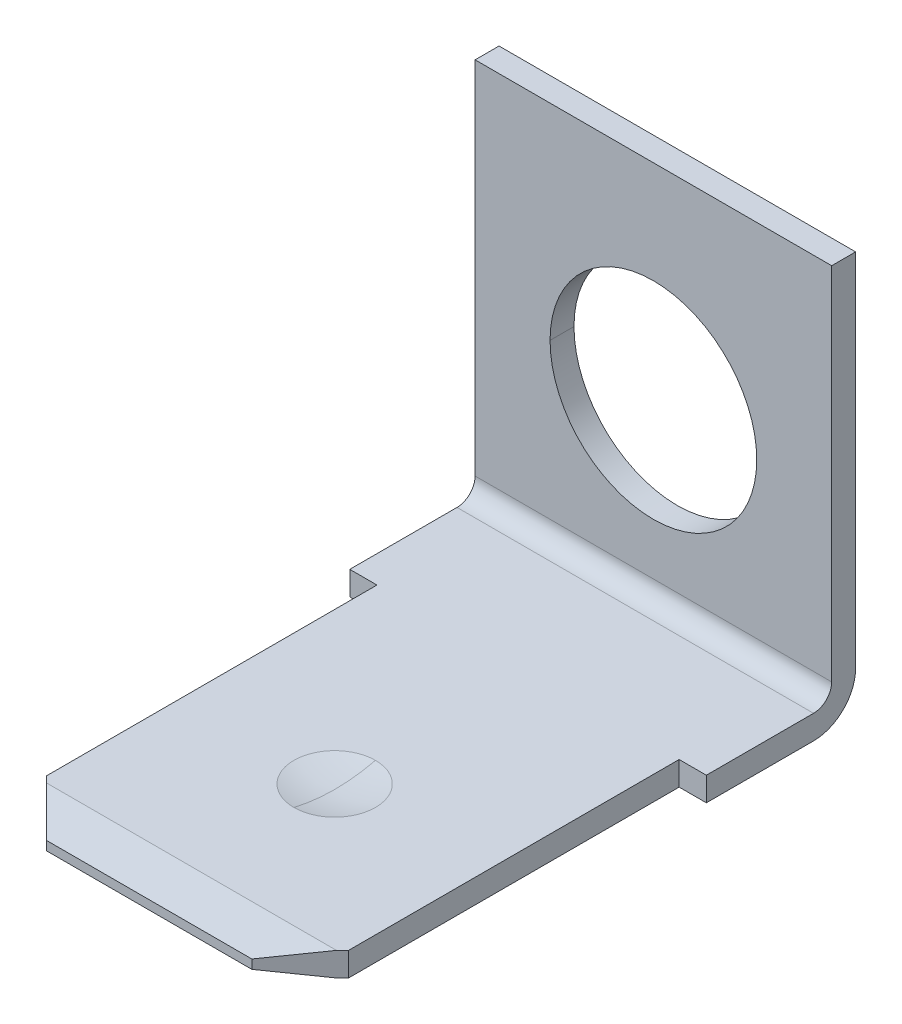
ISO-10303-21;
HEADER;
FILE_DESCRIPTION(('STEP AP214'),'2;1');
FILE_NAME('part.step','',(''),(''),'','','');
FILE_SCHEMA(('AUTOMOTIVE_DESIGN { 1 0 10303 214 1 1 1 1 }'));
ENDSEC;
DATA;
#1=APPLICATION_CONTEXT('core data for automotive mechanical design processes');
#2=APPLICATION_PROTOCOL_DEFINITION('international standard','automotive_design',2000,#1);
#3=PRODUCT_CONTEXT('',#1,'mechanical');
#4=PRODUCT('Part','Part','',(#3));
#5=PRODUCT_RELATED_PRODUCT_CATEGORY('part','',(#4));
#6=PRODUCT_DEFINITION_FORMATION('','',#4);
#7=PRODUCT_DEFINITION_CONTEXT('part definition',#1,'design');
#8=PRODUCT_DEFINITION('design','',#6,#7);
#9=PRODUCT_DEFINITION_SHAPE('','',#8);
#10=(LENGTH_UNIT() NAMED_UNIT(*) SI_UNIT(.MILLI.,.METRE.));
#11=(NAMED_UNIT(*) PLANE_ANGLE_UNIT() SI_UNIT($,.RADIAN.));
#12=(NAMED_UNIT(*) SI_UNIT($,.STERADIAN.) SOLID_ANGLE_UNIT());
#13=UNCERTAINTY_MEASURE_WITH_UNIT(LENGTH_MEASURE(1.E-05),#10,'distance_accuracy_value','');
#14=(GEOMETRIC_REPRESENTATION_CONTEXT(3) GLOBAL_UNCERTAINTY_ASSIGNED_CONTEXT((#13)) GLOBAL_UNIT_ASSIGNED_CONTEXT((#10,
#11,#12)) REPRESENTATION_CONTEXT('',''));
#15=CARTESIAN_POINT('',(0.,0.,0.));
#16=DIRECTION('',(0.,0.,1.));
#17=DIRECTION('',(1.,0.,0.));
#18=AXIS2_PLACEMENT_3D('',#15,#16,#17);
#19=CARTESIAN_POINT('',(0.,4.0686434375,-3.8989));
#20=DIRECTION('',(0.,1.,0.));
#21=DIRECTION('',(0.,0.,-1.));
#22=AXIS2_PLACEMENT_3D('',#19,#20,#21);
#23=SPHERICAL_SURFACE('',#22,3.6673234375);
#24=CARTESIAN_POINT('',(0.,4.0686434375,-3.8989));
#25=DIRECTION('',(1.,0.,0.));
#26=DIRECTION('',(0.,-1.,0.));
#27=AXIS2_PLACEMENT_3D('',#24,#25,#26);
#28=CIRCLE('',#27,3.6673234375);
#29=CARTESIAN_POINT('',(0.,0.40132,-3.8989));
#30=VERTEX_POINT('',#29);
#31=CARTESIAN_POINT('',(0.,0.50292,-4.75615));
#32=VERTEX_POINT('',#31);
#33=EDGE_CURVE('E10',#30,#32,#28,.T.);
#34=ORIENTED_EDGE('',*,*,#33,.F.);
#35=CARTESIAN_POINT('',(0.,4.0686434375,-3.8989));
#36=DIRECTION('',(-1.,0.,0.));
#37=DIRECTION('',(0.,-1.,0.));
#38=AXIS2_PLACEMENT_3D('',#35,#36,#37);
#39=CIRCLE('',#38,3.6673234375);
#40=CARTESIAN_POINT('',(0.,0.50292,-3.04165));
#41=VERTEX_POINT('',#40);
#42=EDGE_CURVE('E26',#30,#41,#39,.T.);
#43=ORIENTED_EDGE('',*,*,#42,.T.);
#44=CARTESIAN_POINT('',(0.,0.50292,-3.8989));
#45=DIRECTION('',(0.,1.,0.));
#46=DIRECTION('',(0.,0.,1.));
#47=AXIS2_PLACEMENT_3D('',#44,#45,#46);
#48=CIRCLE('',#47,0.85725);
#49=EDGE_CURVE('E301',#41,#32,#48,.T.);
#50=ORIENTED_EDGE('',*,*,#49,.T.);
#51=EDGE_LOOP('',(#34,#43,#50));
#52=FACE_BOUND('',#51,.T.);
#53=ADVANCED_FACE('F16',(#52),#23,.F.);
#54=CARTESIAN_POINT('',(0.,4.0686434375,-3.8989));
#55=DIRECTION('',(0.,1.,0.));
#56=DIRECTION('',(0.,0.,-1.));
#57=AXIS2_PLACEMENT_3D('',#54,#55,#56);
#58=SPHERICAL_SURFACE('',#57,3.6673234375);
#59=ORIENTED_EDGE('',*,*,#42,.F.);
#60=ORIENTED_EDGE('',*,*,#33,.T.);
#61=CARTESIAN_POINT('',(0.,0.50292,-3.8989));
#62=DIRECTION('',(0.,1.,0.));
#63=DIRECTION('',(0.,0.,-1.));
#64=AXIS2_PLACEMENT_3D('',#61,#62,#63);
#65=CIRCLE('',#64,0.85725);
#66=EDGE_CURVE('E304',#32,#41,#65,.T.);
#67=ORIENTED_EDGE('',*,*,#66,.T.);
#68=EDGE_LOOP('',(#59,#60,#67));
#69=FACE_BOUND('',#68,.T.);
#70=ADVANCED_FACE('F557',(#69),#58,.F.);
#71=CARTESIAN_POINT('',(0.,4.1402,-10.59688));
#72=DIRECTION('',(0.,0.,1.));
#73=DIRECTION('',(1.,0.,0.));
#74=AXIS2_PLACEMENT_3D('',#71,#72,#73);
#75=CYLINDRICAL_SURFACE('',#74,2.1717);
#76=DIRECTION('',(0.,0.,-1.));
#77=VECTOR('',#76,1.);
#78=CARTESIAN_POINT('',(-2.1717,4.1402,-10.59688));
#79=LINE('',#78,#77);
#80=CARTESIAN_POINT('',(-2.1717,4.1402,-10.59688));
#81=VERTEX_POINT('',#80);
#82=CARTESIAN_POINT('',(-2.1717,4.1402,-11.0998));
#83=VERTEX_POINT('',#82);
#84=EDGE_CURVE('E211',#81,#83,#79,.T.);
#85=ORIENTED_EDGE('',*,*,#84,.F.);
#86=CARTESIAN_POINT('',(0.,4.1402,-10.59688));
#87=DIRECTION('',(0.,0.,1.));
#88=DIRECTION('',(-1.,0.,0.));
#89=AXIS2_PLACEMENT_3D('',#86,#87,#88);
#90=CIRCLE('',#89,2.1717);
#91=CARTESIAN_POINT('',(2.1717,4.1402,-10.59688));
#92=VERTEX_POINT('',#91);
#93=EDGE_CURVE('E271',#81,#92,#90,.T.);
#94=ORIENTED_EDGE('',*,*,#93,.T.);
#95=DIRECTION('',(0.,0.,-1.));
#96=VECTOR('',#95,1.);
#97=CARTESIAN_POINT('',(2.1717,4.1402,-10.59688));
#98=LINE('',#97,#96);
#99=CARTESIAN_POINT('',(2.1717,4.1402,-11.0998));
#100=VERTEX_POINT('',#99);
#101=EDGE_CURVE('E345',#92,#100,#98,.T.);
#102=ORIENTED_EDGE('',*,*,#101,.T.);
#103=CARTESIAN_POINT('',(0.,4.1402,-11.0998));
#104=DIRECTION('',(0.,0.,1.));
#105=DIRECTION('',(-1.,0.,0.));
#106=AXIS2_PLACEMENT_3D('',#103,#104,#105);
#107=CIRCLE('',#106,2.1717);
#108=EDGE_CURVE('E207',#83,#100,#107,.T.);
#109=ORIENTED_EDGE('',*,*,#108,.F.);
#110=EDGE_LOOP('',(#85,#94,#102,#109));
#111=FACE_BOUND('',#110,.T.);
#112=ADVANCED_FACE('F561',(#111),#75,.F.);
#113=CARTESIAN_POINT('',(0.,4.1402,-10.59688));
#114=DIRECTION('',(0.,0.,1.));
#115=DIRECTION('',(1.,0.,0.));
#116=AXIS2_PLACEMENT_3D('',#113,#114,#115);
#117=CYLINDRICAL_SURFACE('',#116,2.1717);
#118=ORIENTED_EDGE('',*,*,#101,.F.);
#119=CARTESIAN_POINT('',(0.,4.1402,-10.59688));
#120=DIRECTION('',(0.,0.,1.));
#121=DIRECTION('',(1.,0.,0.));
#122=AXIS2_PLACEMENT_3D('',#119,#120,#121);
#123=CIRCLE('',#122,2.1717);
#124=EDGE_CURVE('E313',#92,#81,#123,.T.);
#125=ORIENTED_EDGE('',*,*,#124,.T.);
#126=ORIENTED_EDGE('',*,*,#84,.T.);
#127=CARTESIAN_POINT('',(0.,4.1402,-11.0998));
#128=DIRECTION('',(0.,0.,1.));
#129=DIRECTION('',(1.,0.,0.));
#130=AXIS2_PLACEMENT_3D('',#127,#128,#129);
#131=CIRCLE('',#130,2.1717);
#132=EDGE_CURVE('E276',#100,#83,#131,.T.);
#133=ORIENTED_EDGE('',*,*,#132,.F.);
#134=EDGE_LOOP('',(#118,#125,#126,#133));
#135=FACE_BOUND('',#134,.T.);
#136=ADVANCED_FACE('F567',(#135),#117,.F.);
#137=CARTESIAN_POINT('',(0.,-3.5657234375,-3.8989));
#138=DIRECTION('',(0.,1.,0.));
#139=DIRECTION('',(0.,0.,-1.));
#140=AXIS2_PLACEMENT_3D('',#137,#138,#139);
#141=SPHERICAL_SURFACE('',#140,3.6673234375);
#142=CARTESIAN_POINT('',(0.,-3.5657234375,-3.8989));
#143=DIRECTION('',(-1.,0.,0.));
#144=DIRECTION('',(0.,0.972295871435534,0.233753584762708));
#145=AXIS2_PLACEMENT_3D('',#142,#143,#144);
#146=CIRCLE('',#145,3.6673234375);
#147=CARTESIAN_POINT('',(0.,0.,-3.04165));
#148=VERTEX_POINT('',#147);
#149=CARTESIAN_POINT('',(0.,0.1016,-3.8989));
#150=VERTEX_POINT('',#149);
#151=EDGE_CURVE('E342',#148,#150,#146,.T.);
#152=ORIENTED_EDGE('',*,*,#151,.T.);
#153=CARTESIAN_POINT('',(0.,-3.5657234375,-3.8989));
#154=DIRECTION('',(1.,0.,0.));
#155=DIRECTION('',(0.,0.972295871435534,-0.233753584762708));
#156=AXIS2_PLACEMENT_3D('',#153,#154,#155);
#157=CIRCLE('',#156,3.6673234375);
#158=CARTESIAN_POINT('',(0.,0.,-4.75615));
#159=VERTEX_POINT('',#158);
#160=EDGE_CURVE('E243',#159,#150,#157,.T.);
#161=ORIENTED_EDGE('',*,*,#160,.F.);
#162=CARTESIAN_POINT('',(0.,0.,-3.8989));
#163=DIRECTION('',(0.,1.,0.));
#164=DIRECTION('',(0.,0.,1.));
#165=AXIS2_PLACEMENT_3D('',#162,#163,#164);
#166=CIRCLE('',#165,0.85725);
#167=EDGE_CURVE('E183',#148,#159,#166,.T.);
#168=ORIENTED_EDGE('',*,*,#167,.F.);
#169=EDGE_LOOP('',(#152,#161,#168));
#170=FACE_BOUND('',#169,.T.);
#171=ADVANCED_FACE('F570',(#170),#141,.F.);
#172=CARTESIAN_POINT('',(0.,-3.5657234375,-3.8989));
#173=DIRECTION('',(0.,1.,0.));
#174=DIRECTION('',(0.,0.,-1.));
#175=AXIS2_PLACEMENT_3D('',#172,#173,#174);
#176=SPHERICAL_SURFACE('',#175,3.6673234375);
#177=ORIENTED_EDGE('',*,*,#160,.T.);
#178=ORIENTED_EDGE('',*,*,#151,.F.);
#179=CARTESIAN_POINT('',(0.,0.,-3.8989));
#180=DIRECTION('',(0.,1.,0.));
#181=DIRECTION('',(0.,0.,-1.));
#182=AXIS2_PLACEMENT_3D('',#179,#180,#181);
#183=CIRCLE('',#182,0.85725);
#184=EDGE_CURVE('E172',#159,#148,#183,.T.);
#185=ORIENTED_EDGE('',*,*,#184,.F.);
#186=EDGE_LOOP('',(#177,#178,#185));
#187=FACE_BOUND('',#186,.T.);
#188=ADVANCED_FACE('F651',(#187),#176,.F.);
#189=CARTESIAN_POINT('',(3.175,0.50292,-7.9629));
#190=DIRECTION('',(-1.,0.,0.));
#191=DIRECTION('',(0.,0.,1.));
#192=AXIS2_PLACEMENT_3D('',#189,#190,#191);
#193=PLANE('',#192);
#194=DIRECTION('',(0.,-1.,0.));
#195=VECTOR('',#194,1.);
#196=CARTESIAN_POINT('',(3.175,0.50292,-7.9629));
#197=LINE('',#196,#195);
#198=CARTESIAN_POINT('',(3.175,0.50292,-7.9629));
#199=VERTEX_POINT('',#198);
#200=CARTESIAN_POINT('',(3.175,0.,-7.9629));
#201=VERTEX_POINT('',#200);
#202=EDGE_CURVE('E256',#199,#201,#197,.T.);
#203=ORIENTED_EDGE('',*,*,#202,.F.);
#204=DIRECTION('',(0.,0.,1.));
#205=VECTOR('',#204,1.);
#206=CARTESIAN_POINT('',(3.175,0.50292,-7.9629));
#207=LINE('',#206,#205);
#208=CARTESIAN_POINT('',(3.175,0.50292,-1.016));
#209=VERTEX_POINT('',#208);
#210=EDGE_CURVE('E309',#199,#209,#207,.T.);
#211=ORIENTED_EDGE('',*,*,#210,.T.);
#212=DIRECTION('',(0.,-1.,0.));
#213=VECTOR('',#212,1.);
#214=CARTESIAN_POINT('',(3.175,0.50292,-1.016));
#215=LINE('',#214,#213);
#216=CARTESIAN_POINT('',(3.175,0.,-1.016));
#217=VERTEX_POINT('',#216);
#218=EDGE_CURVE('E229',#209,#217,#215,.T.);
#219=ORIENTED_EDGE('',*,*,#218,.T.);
#220=DIRECTION('',(0.,0.,1.));
#221=VECTOR('',#220,1.);
#222=CARTESIAN_POINT('',(3.175,0.,-7.9629));
#223=LINE('',#222,#221);
#224=EDGE_CURVE('E263',#201,#217,#223,.T.);
#225=ORIENTED_EDGE('',*,*,#224,.F.);
#226=EDGE_LOOP('',(#203,#211,#219,#225));
#227=FACE_BOUND('',#226,.T.);
#228=ADVANCED_FACE('F508',(#227),#193,.F.);
#229=CARTESIAN_POINT('',(-3.7465,0.3461653141502,0.));
#230=DIRECTION('',(0.,0.,1.));
#231=DIRECTION('',(1.,0.,0.));
#232=AXIS2_PLACEMENT_3D('',#229,#230,#231);
#233=PLANE('',#232);
#234=DIRECTION('',(1.,0.,0.));
#235=VECTOR('',#234,1.);
#236=CARTESIAN_POINT('',(-2.159,0.3461653141502,0.));
#237=LINE('',#236,#235);
#238=CARTESIAN_POINT('',(-2.159,0.3461653141502,0.));
#239=VERTEX_POINT('',#238);
#240=CARTESIAN_POINT('',(2.159,0.3461653141502,0.));
#241=VERTEX_POINT('',#240);
#242=EDGE_CURVE('E99',#239,#241,#237,.T.);
#243=ORIENTED_EDGE('',*,*,#242,.F.);
#244=DIRECTION('',(0.,-1.,0.));
#245=VECTOR('',#244,1.);
#246=CARTESIAN_POINT('',(-2.159,0.3461653141502,0.));
#247=LINE('',#246,#245);
#248=CARTESIAN_POINT('',(-2.159,0.1567546858498,0.));
#249=VERTEX_POINT('',#248);
#250=EDGE_CURVE('E232',#239,#249,#247,.T.);
#251=ORIENTED_EDGE('',*,*,#250,.T.);
#252=DIRECTION('',(1.,0.,0.));
#253=VECTOR('',#252,1.);
#254=CARTESIAN_POINT('',(-2.159,0.1567546858498,0.));
#255=LINE('',#254,#253);
#256=CARTESIAN_POINT('',(2.159,0.1567546858498,0.));
#257=VERTEX_POINT('',#256);
#258=EDGE_CURVE('E87',#249,#257,#255,.T.);
#259=ORIENTED_EDGE('',*,*,#258,.T.);
#260=DIRECTION('',(0.,-1.,0.));
#261=VECTOR('',#260,1.);
#262=CARTESIAN_POINT('',(2.159,0.3461653141502,0.));
#263=LINE('',#262,#261);
#264=EDGE_CURVE('E250',#241,#257,#263,.T.);
#265=ORIENTED_EDGE('',*,*,#264,.F.);
#266=EDGE_LOOP('',(#243,#251,#259,#265));
#267=FACE_BOUND('',#266,.T.);
#268=ADVANCED_FACE('F718',(#267),#233,.T.);
#269=CARTESIAN_POINT('',(-3.7465,0.1567546858498,0.));
#270=DIRECTION('',(0.,-0.984807753012213,0.173648177666903));
#271=DIRECTION('',(-1.,0.,0.));
#272=AXIS2_PLACEMENT_3D('',#269,#270,#271);
#273=PLANE('',#272);
#274=ORIENTED_EDGE('',*,*,#258,.F.);
#275=DIRECTION('',(0.701673843159863,0.123724030206493,0.701673843159863));
#276=VECTOR('',#275,1.);
#277=CARTESIAN_POINT('',(-3.048,0.,-0.889));
#278=LINE('',#277,#276);
#279=CARTESIAN_POINT('',(-3.048,0.,-0.889));
#280=VERTEX_POINT('',#279);
#281=EDGE_CURVE('E171',#280,#249,#278,.T.);
#282=ORIENTED_EDGE('',*,*,#281,.F.);
#283=DIRECTION('',(1.,0.,0.));
#284=VECTOR('',#283,1.);
#285=CARTESIAN_POINT('',(-3.048,0.,-0.889));
#286=LINE('',#285,#284);
#287=CARTESIAN_POINT('',(3.048,0.,-0.889));
#288=VERTEX_POINT('',#287);
#289=EDGE_CURVE('E189',#280,#288,#286,.T.);
#290=ORIENTED_EDGE('',*,*,#289,.T.);
#291=DIRECTION('',(-0.701673843159863,0.123724030206493,0.701673843159863));
#292=VECTOR('',#291,1.);
#293=CARTESIAN_POINT('',(3.048,0.,-0.889));
#294=LINE('',#293,#292);
#295=EDGE_CURVE('E288',#288,#257,#294,.T.);
#296=ORIENTED_EDGE('',*,*,#295,.T.);
#297=EDGE_LOOP('',(#274,#282,#290,#296));
#298=FACE_BOUND('',#297,.T.);
#299=ADVANCED_FACE('F728',(#298),#273,.T.);
#300=CARTESIAN_POINT('',(3.175,0.50292,-1.016));
#301=DIRECTION('',(-0.707106781186548,0.,-0.707106781186548));
#302=DIRECTION('',(-0.707106781186548,0.,0.707106781186548));
#303=AXIS2_PLACEMENT_3D('',#300,#301,#302);
#304=PLANE('',#303);
#305=ORIENTED_EDGE('',*,*,#218,.F.);
#306=DIRECTION('',(0.707106781186548,0.,-0.707106781186548));
#307=VECTOR('',#306,1.);
#308=CARTESIAN_POINT('',(3.048,0.50292,-0.889));
#309=LINE('',#308,#307);
#310=CARTESIAN_POINT('',(3.048,0.50292,-0.889));
#311=VERTEX_POINT('',#310);
#312=EDGE_CURVE('E19',#311,#209,#309,.T.);
#313=ORIENTED_EDGE('',*,*,#312,.F.);
#314=DIRECTION('',(-0.701673843159863,-0.123724030206493,0.701673843159863));
#315=VECTOR('',#314,1.);
#316=CARTESIAN_POINT('',(3.048,0.50292,-0.889));
#317=LINE('',#316,#315);
#318=EDGE_CURVE('E222',#311,#241,#317,.T.);
#319=ORIENTED_EDGE('',*,*,#318,.T.);
#320=ORIENTED_EDGE('',*,*,#264,.T.);
#321=ORIENTED_EDGE('',*,*,#295,.F.);
#322=DIRECTION('',(0.707106781186548,0.,-0.707106781186548));
#323=VECTOR('',#322,1.);
#324=CARTESIAN_POINT('',(3.048,0.,-0.889));
#325=LINE('',#324,#323);
#326=EDGE_CURVE('E196',#288,#217,#325,.T.);
#327=ORIENTED_EDGE('',*,*,#326,.T.);
#328=EDGE_LOOP('',(#305,#313,#319,#320,#321,#327));
#329=FACE_BOUND('',#328,.T.);
#330=ADVANCED_FACE('F738',(#329),#304,.F.);
#331=CARTESIAN_POINT('',(-3.7465,0.50292,-0.889));
#332=DIRECTION('',(0.,0.984807753012213,0.173648177666903));
#333=DIRECTION('',(1.,0.,0.));
#334=AXIS2_PLACEMENT_3D('',#331,#332,#333);
#335=PLANE('',#334);
#336=DIRECTION('',(1.,0.,0.));
#337=VECTOR('',#336,1.);
#338=CARTESIAN_POINT('',(-3.048,0.50292,-0.889));
#339=LINE('',#338,#337);
#340=CARTESIAN_POINT('',(-3.048,0.50292,-0.889));
#341=VERTEX_POINT('',#340);
#342=EDGE_CURVE('E245',#341,#311,#339,.T.);
#343=ORIENTED_EDGE('',*,*,#342,.F.);
#344=DIRECTION('',(0.701673843159863,-0.123724030206493,0.701673843159863));
#345=VECTOR('',#344,1.);
#346=CARTESIAN_POINT('',(-3.048,0.50292,-0.889));
#347=LINE('',#346,#345);
#348=EDGE_CURVE('E223',#341,#239,#347,.T.);
#349=ORIENTED_EDGE('',*,*,#348,.T.);
#350=ORIENTED_EDGE('',*,*,#242,.T.);
#351=ORIENTED_EDGE('',*,*,#318,.F.);
#352=EDGE_LOOP('',(#343,#349,#350,#351));
#353=FACE_BOUND('',#352,.T.);
#354=ADVANCED_FACE('F590',(#353),#335,.T.);
#355=CARTESIAN_POINT('',(-2.159,0.50292,0.));
#356=DIRECTION('',(0.707106781186548,0.,-0.707106781186548));
#357=DIRECTION('',(0.,-1.,0.));
#358=AXIS2_PLACEMENT_3D('',#355,#356,#357);
#359=PLANE('',#358);
#360=ORIENTED_EDGE('',*,*,#281,.T.);
#361=ORIENTED_EDGE('',*,*,#250,.F.);
#362=ORIENTED_EDGE('',*,*,#348,.F.);
#363=DIRECTION('',(-0.707106781186548,0.,-0.707106781186548));
#364=VECTOR('',#363,1.);
#365=CARTESIAN_POINT('',(-3.048,0.50292,-0.889));
#366=LINE('',#365,#364);
#367=CARTESIAN_POINT('',(-3.175,0.50292,-1.016));
#368=VERTEX_POINT('',#367);
#369=EDGE_CURVE('E167',#341,#368,#366,.T.);
#370=ORIENTED_EDGE('',*,*,#369,.T.);
#371=DIRECTION('',(0.,-1.,0.));
#372=VECTOR('',#371,1.);
#373=CARTESIAN_POINT('',(-3.175,0.50292,-1.016));
#374=LINE('',#373,#372);
#375=CARTESIAN_POINT('',(-3.175,0.,-1.016));
#376=VERTEX_POINT('',#375);
#377=EDGE_CURVE('E158',#368,#376,#374,.T.);
#378=ORIENTED_EDGE('',*,*,#377,.T.);
#379=DIRECTION('',(-0.707106781186548,0.,-0.707106781186548));
#380=VECTOR('',#379,1.);
#381=CARTESIAN_POINT('',(-3.048,0.,-0.889));
#382=LINE('',#381,#380);
#383=EDGE_CURVE('E163',#280,#376,#382,.T.);
#384=ORIENTED_EDGE('',*,*,#383,.F.);
#385=EDGE_LOOP('',(#360,#361,#362,#370,#378,#384));
#386=FACE_BOUND('',#385,.T.);
#387=ADVANCED_FACE('F161',(#386),#359,.F.);
#388=CARTESIAN_POINT('',(-3.175,0.50292,-1.016));
#389=DIRECTION('',(1.,0.,0.));
#390=DIRECTION('',(0.,1.,0.));
#391=AXIS2_PLACEMENT_3D('',#388,#389,#390);
#392=PLANE('',#391);
#393=ORIENTED_EDGE('',*,*,#377,.F.);
#394=DIRECTION('',(0.,0.,-1.));
#395=VECTOR('',#394,1.);
#396=CARTESIAN_POINT('',(-3.175,0.50292,-1.016));
#397=LINE('',#396,#395);
#398=CARTESIAN_POINT('',(-3.175,0.50292,-7.9629));
#399=VERTEX_POINT('',#398);
#400=EDGE_CURVE('E273',#368,#399,#397,.T.);
#401=ORIENTED_EDGE('',*,*,#400,.T.);
#402=DIRECTION('',(0.,-1.,0.));
#403=VECTOR('',#402,1.);
#404=CARTESIAN_POINT('',(-3.175,0.50292,-7.9629));
#405=LINE('',#404,#403);
#406=CARTESIAN_POINT('',(-3.175,0.,-7.9629));
#407=VERTEX_POINT('',#406);
#408=EDGE_CURVE('E179',#399,#407,#405,.T.);
#409=ORIENTED_EDGE('',*,*,#408,.T.);
#410=DIRECTION('',(0.,0.,-1.));
#411=VECTOR('',#410,1.);
#412=CARTESIAN_POINT('',(-3.175,0.,-1.016));
#413=LINE('',#412,#411);
#414=EDGE_CURVE('E176',#376,#407,#413,.T.);
#415=ORIENTED_EDGE('',*,*,#414,.F.);
#416=EDGE_LOOP('',(#393,#401,#409,#415));
#417=FACE_BOUND('',#416,.T.);
#418=ADVANCED_FACE('F177',(#417),#392,.F.);
#419=CARTESIAN_POINT('',(-3.7465,0.,-0.889));
#420=DIRECTION('',(0.,-1.,0.));
#421=DIRECTION('',(0.,0.,-1.));
#422=AXIS2_PLACEMENT_3D('',#419,#420,#421);
#423=PLANE('',#422);
#424=ORIENTED_EDGE('',*,*,#167,.T.);
#425=ORIENTED_EDGE('',*,*,#184,.T.);
#426=EDGE_LOOP('',(#424,#425));
#427=FACE_BOUND('',#426,.T.);
#428=ORIENTED_EDGE('',*,*,#224,.T.);
#429=ORIENTED_EDGE('',*,*,#326,.F.);
#430=ORIENTED_EDGE('',*,*,#289,.F.);
#431=ORIENTED_EDGE('',*,*,#383,.T.);
#432=ORIENTED_EDGE('',*,*,#414,.T.);
#433=DIRECTION('',(1.,0.,0.));
#434=VECTOR('',#433,1.);
#435=CARTESIAN_POINT('',(-3.7465,0.,-7.9629));
#436=LINE('',#435,#434);
#437=CARTESIAN_POINT('',(-3.7465,0.,-7.9629));
#438=VERTEX_POINT('',#437);
#439=EDGE_CURVE('E202',#438,#407,#436,.T.);
#440=ORIENTED_EDGE('',*,*,#439,.F.);
#441=DIRECTION('',(0.,0.,-1.));
#442=VECTOR('',#441,1.);
#443=CARTESIAN_POINT('',(-3.7465,0.,-7.9629));
#444=LINE('',#443,#442);
#445=CARTESIAN_POINT('',(-3.7465,0.,-10.21588));
#446=VERTEX_POINT('',#445);
#447=EDGE_CURVE('E220',#438,#446,#444,.T.);
#448=ORIENTED_EDGE('',*,*,#447,.T.);
#449=DIRECTION('',(1.,0.,0.));
#450=VECTOR('',#449,1.);
#451=CARTESIAN_POINT('',(-3.7465,0.,-10.21588));
#452=LINE('',#451,#450);
#453=CARTESIAN_POINT('',(3.7465,0.,-10.21588));
#454=VERTEX_POINT('',#453);
#455=EDGE_CURVE('E266',#446,#454,#452,.T.);
#456=ORIENTED_EDGE('',*,*,#455,.T.);
#457=DIRECTION('',(0.,0.,-1.));
#458=VECTOR('',#457,1.);
#459=CARTESIAN_POINT('',(3.7465,0.,-7.9629));
#460=LINE('',#459,#458);
#461=CARTESIAN_POINT('',(3.7465,0.,-7.9629));
#462=VERTEX_POINT('',#461);
#463=EDGE_CURVE('E426',#462,#454,#460,.T.);
#464=ORIENTED_EDGE('',*,*,#463,.F.);
#465=DIRECTION('',(-1.,0.,0.));
#466=VECTOR('',#465,1.);
#467=CARTESIAN_POINT('',(3.7465,0.,-7.9629));
#468=LINE('',#467,#466);
#469=EDGE_CURVE('E251',#462,#201,#468,.T.);
#470=ORIENTED_EDGE('',*,*,#469,.T.);
#471=EDGE_LOOP('',(#428,#429,#430,#431,#432,#440,#448,#456,#464,#470));
#472=FACE_BOUND('',#471,.T.);
#473=ADVANCED_FACE('F186',(#427,#472),#423,.T.);
#474=CARTESIAN_POINT('',(-3.7465,0.88392,-10.21588));
#475=DIRECTION('',(1.,0.,0.));
#476=DIRECTION('',(0.,0.,-1.));
#477=AXIS2_PLACEMENT_3D('',#474,#475,#476);
#478=CYLINDRICAL_SURFACE('',#477,0.88392);
#479=DIRECTION('',(1.,0.,0.));
#480=VECTOR('',#479,1.);
#481=CARTESIAN_POINT('',(-3.7465,0.88392,-11.0998));
#482=LINE('',#481,#480);
#483=CARTESIAN_POINT('',(-3.7465,0.88392,-11.0998));
#484=VERTEX_POINT('',#483);
#485=CARTESIAN_POINT('',(3.7465,0.88392,-11.0998));
#486=VERTEX_POINT('',#485);
#487=EDGE_CURVE('E203',#484,#486,#482,.T.);
#488=ORIENTED_EDGE('',*,*,#487,.T.);
#489=CARTESIAN_POINT('',(3.7465,0.88392,-10.21588));
#490=DIRECTION('',(1.,0.,0.));
#491=DIRECTION('',(0.,-1.,0.));
#492=AXIS2_PLACEMENT_3D('',#489,#490,#491);
#493=CIRCLE('',#492,0.88392);
#494=EDGE_CURVE('E423',#454,#486,#493,.T.);
#495=ORIENTED_EDGE('',*,*,#494,.F.);
#496=ORIENTED_EDGE('',*,*,#455,.F.);
#497=CARTESIAN_POINT('',(-3.7465,0.88392,-10.21588));
#498=DIRECTION('',(1.,0.,0.));
#499=DIRECTION('',(0.,-1.,0.));
#500=AXIS2_PLACEMENT_3D('',#497,#498,#499);
#501=CIRCLE('',#500,0.88392);
#502=EDGE_CURVE('E355',#446,#484,#501,.T.);
#503=ORIENTED_EDGE('',*,*,#502,.T.);
#504=EDGE_LOOP('',(#488,#495,#496,#503));
#505=FACE_BOUND('',#504,.T.);
#506=ADVANCED_FACE('F454',(#505),#478,.T.);
#507=CARTESIAN_POINT('',(-3.7465,0.88392,-11.0998));
#508=DIRECTION('',(0.,0.,-1.));
#509=DIRECTION('',(0.,-1.,0.));
#510=AXIS2_PLACEMENT_3D('',#507,#508,#509);
#511=PLANE('',#510);
#512=ORIENTED_EDGE('',*,*,#108,.T.);
#513=ORIENTED_EDGE('',*,*,#132,.T.);
#514=EDGE_LOOP('',(#512,#513));
#515=FACE_BOUND('',#514,.T.);
#516=DIRECTION('',(1.,0.,0.));
#517=VECTOR('',#516,1.);
#518=CARTESIAN_POINT('',(-3.7465,8.4582,-11.0998));
#519=LINE('',#518,#517);
#520=CARTESIAN_POINT('',(-3.7465,8.4582,-11.0998));
#521=VERTEX_POINT('',#520);
#522=CARTESIAN_POINT('',(3.7465,8.4582,-11.0998));
#523=VERTEX_POINT('',#522);
#524=EDGE_CURVE('E208',#521,#523,#519,.T.);
#525=ORIENTED_EDGE('',*,*,#524,.T.);
#526=DIRECTION('',(0.,1.,0.));
#527=VECTOR('',#526,1.);
#528=CARTESIAN_POINT('',(3.7465,0.88392,-11.0998));
#529=LINE('',#528,#527);
#530=EDGE_CURVE('E338',#486,#523,#529,.T.);
#531=ORIENTED_EDGE('',*,*,#530,.F.);
#532=ORIENTED_EDGE('',*,*,#487,.F.);
#533=DIRECTION('',(0.,1.,0.));
#534=VECTOR('',#533,1.);
#535=CARTESIAN_POINT('',(-3.7465,0.88392,-11.0998));
#536=LINE('',#535,#534);
#537=EDGE_CURVE('E358',#484,#521,#536,.T.);
#538=ORIENTED_EDGE('',*,*,#537,.T.);
#539=EDGE_LOOP('',(#525,#531,#532,#538));
#540=FACE_BOUND('',#539,.T.);
#541=ADVANCED_FACE('F543',(#515,#540),#511,.T.);
#542=CARTESIAN_POINT('',(-3.7465,8.4582,-11.0998));
#543=DIRECTION('',(0.,1.,0.));
#544=DIRECTION('',(1.,0.,0.));
#545=AXIS2_PLACEMENT_3D('',#542,#543,#544);
#546=PLANE('',#545);
#547=DIRECTION('',(1.,0.,0.));
#548=VECTOR('',#547,1.);
#549=CARTESIAN_POINT('',(-3.7465,8.4582,-10.59688));
#550=LINE('',#549,#548);
#551=CARTESIAN_POINT('',(-3.7465,8.4582,-10.59688));
#552=VERTEX_POINT('',#551);
#553=CARTESIAN_POINT('',(3.7465,8.4582,-10.59688));
#554=VERTEX_POINT('',#553);
#555=EDGE_CURVE('E267',#552,#554,#550,.T.);
#556=ORIENTED_EDGE('',*,*,#555,.T.);
#557=DIRECTION('',(0.,0.,1.));
#558=VECTOR('',#557,1.);
#559=CARTESIAN_POINT('',(3.7465,8.4582,-11.0998));
#560=LINE('',#559,#558);
#561=EDGE_CURVE('E262',#523,#554,#560,.T.);
#562=ORIENTED_EDGE('',*,*,#561,.F.);
#563=ORIENTED_EDGE('',*,*,#524,.F.);
#564=DIRECTION('',(0.,0.,1.));
#565=VECTOR('',#564,1.);
#566=CARTESIAN_POINT('',(-3.7465,8.4582,-11.0998));
#567=LINE('',#566,#565);
#568=EDGE_CURVE('E284',#521,#552,#567,.T.);
#569=ORIENTED_EDGE('',*,*,#568,.T.);
#570=EDGE_LOOP('',(#556,#562,#563,#569));
#571=FACE_BOUND('',#570,.T.);
#572=ADVANCED_FACE('F541',(#571),#546,.T.);
#573=CARTESIAN_POINT('',(-3.7465,8.4582,-10.59688));
#574=DIRECTION('',(0.,0.,1.));
#575=DIRECTION('',(1.,0.,0.));
#576=AXIS2_PLACEMENT_3D('',#573,#574,#575);
#577=PLANE('',#576);
#578=ORIENTED_EDGE('',*,*,#93,.F.);
#579=ORIENTED_EDGE('',*,*,#124,.F.);
#580=EDGE_LOOP('',(#578,#579));
#581=FACE_BOUND('',#580,.T.);
#582=DIRECTION('',(1.,0.,0.));
#583=VECTOR('',#582,1.);
#584=CARTESIAN_POINT('',(-3.7465,0.88392,-10.59688));
#585=LINE('',#584,#583);
#586=CARTESIAN_POINT('',(-3.7465,0.88392,-10.59688));
#587=VERTEX_POINT('',#586);
#588=CARTESIAN_POINT('',(3.7465,0.88392,-10.59688));
#589=VERTEX_POINT('',#588);
#590=EDGE_CURVE('E272',#587,#589,#585,.T.);
#591=ORIENTED_EDGE('',*,*,#590,.T.);
#592=DIRECTION('',(0.,-1.,0.));
#593=VECTOR('',#592,1.);
#594=CARTESIAN_POINT('',(3.7465,8.4582,-10.59688));
#595=LINE('',#594,#593);
#596=EDGE_CURVE('E257',#554,#589,#595,.T.);
#597=ORIENTED_EDGE('',*,*,#596,.F.);
#598=ORIENTED_EDGE('',*,*,#555,.F.);
#599=DIRECTION('',(0.,-1.,0.));
#600=VECTOR('',#599,1.);
#601=CARTESIAN_POINT('',(-3.7465,8.4582,-10.59688));
#602=LINE('',#601,#600);
#603=EDGE_CURVE('E280',#552,#587,#602,.T.);
#604=ORIENTED_EDGE('',*,*,#603,.T.);
#605=EDGE_LOOP('',(#591,#597,#598,#604));
#606=FACE_BOUND('',#605,.T.);
#607=ADVANCED_FACE('F397',(#581,#606),#577,.T.);
#608=CARTESIAN_POINT('',(-3.7465,0.88392,-10.21588));
#609=DIRECTION('',(1.,0.,0.));
#610=DIRECTION('',(0.,0.,-1.));
#611=AXIS2_PLACEMENT_3D('',#608,#609,#610);
#612=CYLINDRICAL_SURFACE('',#611,0.381);
#613=DIRECTION('',(1.,0.,0.));
#614=VECTOR('',#613,1.);
#615=CARTESIAN_POINT('',(-3.7465,0.50292,-10.21588));
#616=LINE('',#615,#614);
#617=CARTESIAN_POINT('',(-3.7465,0.50292,-10.21588));
#618=VERTEX_POINT('',#617);
#619=CARTESIAN_POINT('',(3.7465,0.50292,-10.21588));
#620=VERTEX_POINT('',#619);
#621=EDGE_CURVE('E216',#618,#620,#616,.T.);
#622=ORIENTED_EDGE('',*,*,#621,.T.);
#623=CARTESIAN_POINT('',(3.7465,0.88392,-10.21588));
#624=DIRECTION('',(-1.,0.,0.));
#625=DIRECTION('',(0.,0.,-1.));
#626=AXIS2_PLACEMENT_3D('',#623,#624,#625);
#627=CIRCLE('',#626,0.381);
#628=EDGE_CURVE('E261',#589,#620,#627,.T.);
#629=ORIENTED_EDGE('',*,*,#628,.F.);
#630=ORIENTED_EDGE('',*,*,#590,.F.);
#631=CARTESIAN_POINT('',(-3.7465,0.88392,-10.21588));
#632=DIRECTION('',(-1.,0.,0.));
#633=DIRECTION('',(0.,0.,-1.));
#634=AXIS2_PLACEMENT_3D('',#631,#632,#633);
#635=CIRCLE('',#634,0.381);
#636=EDGE_CURVE('E285',#587,#618,#635,.T.);
#637=ORIENTED_EDGE('',*,*,#636,.T.);
#638=EDGE_LOOP('',(#622,#629,#630,#637));
#639=FACE_BOUND('',#638,.T.);
#640=ADVANCED_FACE('F406',(#639),#612,.F.);
#641=CARTESIAN_POINT('',(3.7465,0.,0.));
#642=DIRECTION('',(1.,0.,0.));
#643=DIRECTION('',(0.,1.,0.));
#644=AXIS2_PLACEMENT_3D('',#641,#642,#643);
#645=PLANE('',#644);
#646=ORIENTED_EDGE('',*,*,#463,.T.);
#647=ORIENTED_EDGE('',*,*,#494,.T.);
#648=ORIENTED_EDGE('',*,*,#530,.T.);
#649=ORIENTED_EDGE('',*,*,#561,.T.);
#650=ORIENTED_EDGE('',*,*,#596,.T.);
#651=ORIENTED_EDGE('',*,*,#628,.T.);
#652=DIRECTION('',(0.,0.,1.));
#653=VECTOR('',#652,1.);
#654=CARTESIAN_POINT('',(3.7465,0.50292,-10.21588));
#655=LINE('',#654,#653);
#656=CARTESIAN_POINT('',(3.7465,0.50292,-7.9629));
#657=VERTEX_POINT('',#656);
#658=EDGE_CURVE('E212',#620,#657,#655,.T.);
#659=ORIENTED_EDGE('',*,*,#658,.T.);
#660=DIRECTION('',(0.,1.,0.));
#661=VECTOR('',#660,1.);
#662=CARTESIAN_POINT('',(3.7465,0.,-7.9629));
#663=LINE('',#662,#661);
#664=EDGE_CURVE('E255',#462,#657,#663,.T.);
#665=ORIENTED_EDGE('',*,*,#664,.F.);
#666=EDGE_LOOP('',(#646,#647,#648,#649,#650,#651,#659,#665));
#667=FACE_BOUND('',#666,.T.);
#668=ADVANCED_FACE('F410',(#667),#645,.T.);
#669=CARTESIAN_POINT('',(3.7465,0.50292,-7.9629));
#670=DIRECTION('',(0.,0.,-1.));
#671=DIRECTION('',(0.,-1.,0.));
#672=AXIS2_PLACEMENT_3D('',#669,#670,#671);
#673=PLANE('',#672);
#674=DIRECTION('',(-1.,0.,0.));
#675=VECTOR('',#674,1.);
#676=CARTESIAN_POINT('',(3.7465,0.50292,-7.9629));
#677=LINE('',#676,#675);
#678=EDGE_CURVE('E305',#657,#199,#677,.T.);
#679=ORIENTED_EDGE('',*,*,#678,.T.);
#680=ORIENTED_EDGE('',*,*,#202,.T.);
#681=ORIENTED_EDGE('',*,*,#469,.F.);
#682=ORIENTED_EDGE('',*,*,#664,.T.);
#683=EDGE_LOOP('',(#679,#680,#681,#682));
#684=FACE_BOUND('',#683,.T.);
#685=ADVANCED_FACE('F504',(#684),#673,.F.);
#686=CARTESIAN_POINT('',(-3.7465,0.50292,-10.21588));
#687=DIRECTION('',(0.,1.,0.));
#688=DIRECTION('',(1.,0.,0.));
#689=AXIS2_PLACEMENT_3D('',#686,#687,#688);
#690=PLANE('',#689);
#691=ORIENTED_EDGE('',*,*,#49,.F.);
#692=ORIENTED_EDGE('',*,*,#66,.F.);
#693=EDGE_LOOP('',(#691,#692));
#694=FACE_BOUND('',#693,.T.);
#695=ORIENTED_EDGE('',*,*,#658,.F.);
#696=ORIENTED_EDGE('',*,*,#621,.F.);
#697=DIRECTION('',(0.,0.,1.));
#698=VECTOR('',#697,1.);
#699=CARTESIAN_POINT('',(-3.7465,0.50292,-10.21588));
#700=LINE('',#699,#698);
#701=CARTESIAN_POINT('',(-3.7465,0.50292,-7.9629));
#702=VERTEX_POINT('',#701);
#703=EDGE_CURVE('E383',#618,#702,#700,.T.);
#704=ORIENTED_EDGE('',*,*,#703,.T.);
#705=DIRECTION('',(1.,0.,0.));
#706=VECTOR('',#705,1.);
#707=CARTESIAN_POINT('',(-3.7465,0.50292,-7.9629));
#708=LINE('',#707,#706);
#709=EDGE_CURVE('E201',#702,#399,#708,.T.);
#710=ORIENTED_EDGE('',*,*,#709,.T.);
#711=ORIENTED_EDGE('',*,*,#400,.F.);
#712=ORIENTED_EDGE('',*,*,#369,.F.);
#713=ORIENTED_EDGE('',*,*,#342,.T.);
#714=ORIENTED_EDGE('',*,*,#312,.T.);
#715=ORIENTED_EDGE('',*,*,#210,.F.);
#716=ORIENTED_EDGE('',*,*,#678,.F.);
#717=EDGE_LOOP('',(#695,#696,#704,#710,#711,#712,#713,#714,#715,#716));
#718=FACE_BOUND('',#717,.T.);
#719=ADVANCED_FACE('F440',(#694,#718),#690,.T.);
#720=CARTESIAN_POINT('',(-3.175,0.50292,-7.9629));
#721=DIRECTION('',(0.,0.,-1.));
#722=DIRECTION('',(0.,-1.,0.));
#723=AXIS2_PLACEMENT_3D('',#720,#721,#722);
#724=PLANE('',#723);
#725=ORIENTED_EDGE('',*,*,#439,.T.);
#726=ORIENTED_EDGE('',*,*,#408,.F.);
#727=ORIENTED_EDGE('',*,*,#709,.F.);
#728=DIRECTION('',(0.,1.,0.));
#729=VECTOR('',#728,1.);
#730=CARTESIAN_POINT('',(-3.7465,0.,-7.9629));
#731=LINE('',#730,#729);
#732=EDGE_CURVE('E217',#438,#702,#731,.T.);
#733=ORIENTED_EDGE('',*,*,#732,.F.);
#734=EDGE_LOOP('',(#725,#726,#727,#733));
#735=FACE_BOUND('',#734,.T.);
#736=ADVANCED_FACE('F444',(#735),#724,.F.);
#737=CARTESIAN_POINT('',(-3.7465,0.,0.));
#738=DIRECTION('',(1.,0.,0.));
#739=DIRECTION('',(0.,1.,0.));
#740=AXIS2_PLACEMENT_3D('',#737,#738,#739);
#741=PLANE('',#740);
#742=ORIENTED_EDGE('',*,*,#703,.F.);
#743=ORIENTED_EDGE('',*,*,#636,.F.);
#744=ORIENTED_EDGE('',*,*,#603,.F.);
#745=ORIENTED_EDGE('',*,*,#568,.F.);
#746=ORIENTED_EDGE('',*,*,#537,.F.);
#747=ORIENTED_EDGE('',*,*,#502,.F.);
#748=ORIENTED_EDGE('',*,*,#447,.F.);
#749=ORIENTED_EDGE('',*,*,#732,.T.);
#750=EDGE_LOOP('',(#742,#743,#744,#745,#746,#747,#748,#749));
#751=FACE_BOUND('',#750,.T.);
#752=ADVANCED_FACE('F452',(#751),#741,.F.);
#753=CLOSED_SHELL('',(#53,#70,#112,#136,#171,#188,#228,#268,#299,#330,#354,#387,#418,#473,#506,
#541,#572,#607,#640,#668,#685,#719,#736,#752));
#754=MANIFOLD_SOLID_BREP('B1',#753);
#755=ADVANCED_BREP_SHAPE_REPRESENTATION('',(#18,#754),#14);
#756=SHAPE_DEFINITION_REPRESENTATION(#9,#755);
ENDSEC;
END-ISO-10303-21;
